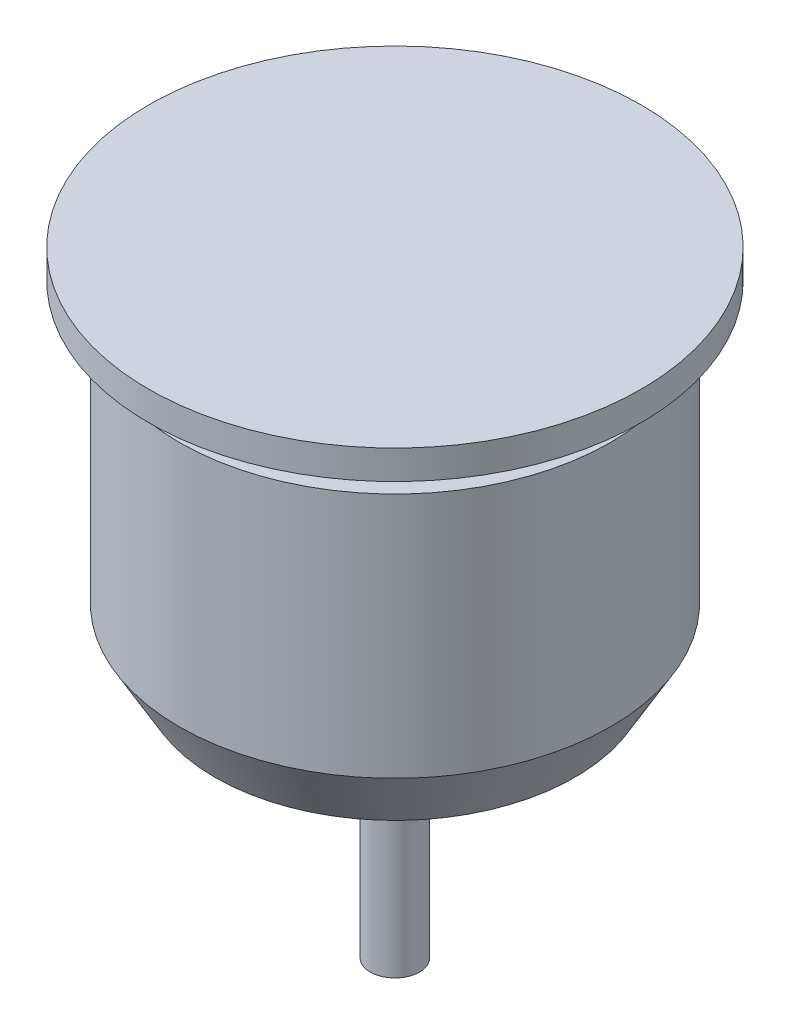
ISO-10303-21;
HEADER;
FILE_DESCRIPTION(('STEP AP214'),'2;1');
FILE_NAME('part.step','',(''),(''),'','','');
FILE_SCHEMA(('AUTOMOTIVE_DESIGN { 1 0 10303 214 1 1 1 1 }'));
ENDSEC;
DATA;
#1=APPLICATION_CONTEXT('core data for automotive mechanical design processes');
#2=APPLICATION_PROTOCOL_DEFINITION('international standard','automotive_design',2000,#1);
#3=PRODUCT_CONTEXT('',#1,'mechanical');
#4=PRODUCT('Part','Part','',(#3));
#5=PRODUCT_RELATED_PRODUCT_CATEGORY('part','',(#4));
#6=PRODUCT_DEFINITION_FORMATION('','',#4);
#7=PRODUCT_DEFINITION_CONTEXT('part definition',#1,'design');
#8=PRODUCT_DEFINITION('design','',#6,#7);
#9=PRODUCT_DEFINITION_SHAPE('','',#8);
#10=(LENGTH_UNIT() NAMED_UNIT(*) SI_UNIT(.MILLI.,.METRE.));
#11=(NAMED_UNIT(*) PLANE_ANGLE_UNIT() SI_UNIT($,.RADIAN.));
#12=(NAMED_UNIT(*) SI_UNIT($,.STERADIAN.) SOLID_ANGLE_UNIT());
#13=UNCERTAINTY_MEASURE_WITH_UNIT(LENGTH_MEASURE(1.E-05),#10,'distance_accuracy_value','');
#14=(GEOMETRIC_REPRESENTATION_CONTEXT(3) GLOBAL_UNCERTAINTY_ASSIGNED_CONTEXT((#13)) GLOBAL_UNIT_ASSIGNED_CONTEXT((#10,
#11,#12)) REPRESENTATION_CONTEXT('',''));
#15=CARTESIAN_POINT('',(0.,0.,0.));
#16=DIRECTION('',(0.,0.,1.));
#17=DIRECTION('',(1.,0.,0.));
#18=AXIS2_PLACEMENT_3D('',#15,#16,#17);
#19=CARTESIAN_POINT('',(0.,30.5766557380375,0.));
#20=DIRECTION('',(0.,-1.,0.));
#21=DIRECTION('',(0.,0.,-1.));
#22=AXIS2_PLACEMENT_3D('',#19,#20,#21);
#23=PLANE('',#22);
#24=CARTESIAN_POINT('',(0.,30.5766557380375,0.));
#25=DIRECTION('',(0.,-1.,0.));
#26=DIRECTION('',(0.,0.,-1.));
#27=AXIS2_PLACEMENT_3D('',#24,#25,#26);
#28=CIRCLE('',#27,1.89972724080792);
#29=CARTESIAN_POINT('',(0.,30.5766557380375,-1.89972724080792));
#30=VERTEX_POINT('',#29);
#31=EDGE_CURVE('E11',#30,#30,#28,.T.);
#32=ORIENTED_EDGE('',*,*,#31,.T.);
#33=EDGE_LOOP('',(#32));
#34=FACE_BOUND('',#33,.T.);
#35=ADVANCED_FACE('F38',(#34),#23,.T.);
#36=CARTESIAN_POINT('',(0.,0.,0.));
#37=DIRECTION('',(0.,-1.,0.));
#38=DIRECTION('',(0.,0.,-1.));
#39=AXIS2_PLACEMENT_3D('',#36,#37,#38);
#40=CYLINDRICAL_SURFACE('',#39,1.89972724080792);
#41=CARTESIAN_POINT('',(0.,32.6480691756281,0.));
#42=DIRECTION('',(0.,-1.,0.));
#43=DIRECTION('',(0.,0.,-1.));
#44=AXIS2_PLACEMENT_3D('',#41,#42,#43);
#45=CIRCLE('',#44,1.89972724080792);
#46=CARTESIAN_POINT('',(0.,32.6480691756281,-1.89972724080792));
#47=VERTEX_POINT('',#46);
#48=EDGE_CURVE('E44',#47,#47,#45,.T.);
#49=ORIENTED_EDGE('',*,*,#48,.T.);
#50=EDGE_LOOP('',(#49));
#51=FACE_BOUND('',#50,.T.);
#52=ORIENTED_EDGE('',*,*,#31,.F.);
#53=EDGE_LOOP('',(#52));
#54=FACE_BOUND('',#53,.T.);
#55=ADVANCED_FACE('F82',(#51,#54),#40,.T.);
#56=CARTESIAN_POINT('',(1.89972724080792,32.6480691756281,0.));
#57=DIRECTION('',(0.,-1.,0.));
#58=DIRECTION('',(0.,0.,-1.));
#59=AXIS2_PLACEMENT_3D('',#56,#57,#58);
#60=PLANE('',#59);
#61=CARTESIAN_POINT('',(0.,32.6480691756281,0.));
#62=DIRECTION('',(0.,-1.,0.));
#63=DIRECTION('',(0.,0.,-1.));
#64=AXIS2_PLACEMENT_3D('',#61,#62,#63);
#65=CIRCLE('',#64,12.5329828871063);
#66=CARTESIAN_POINT('',(0.,32.6480691756281,-12.5329828871063));
#67=VERTEX_POINT('',#66);
#68=EDGE_CURVE('E48',#67,#67,#65,.T.);
#69=ORIENTED_EDGE('',*,*,#68,.T.);
#70=EDGE_LOOP('',(#69));
#71=FACE_BOUND('',#70,.T.);
#72=ORIENTED_EDGE('',*,*,#48,.F.);
#73=EDGE_LOOP('',(#72));
#74=FACE_BOUND('',#73,.T.);
#75=ADVANCED_FACE('F86',(#71,#74),#60,.T.);
#76=CARTESIAN_POINT('',(0.,0.,0.));
#77=DIRECTION('',(0.,-1.,0.));
#78=DIRECTION('',(0.,0.,-1.));
#79=AXIS2_PLACEMENT_3D('',#76,#77,#78);
#80=CYLINDRICAL_SURFACE('',#79,12.5329828871063);
#81=CARTESIAN_POINT('',(0.,45.,0.));
#82=DIRECTION('',(0.,-1.,0.));
#83=DIRECTION('',(0.,0.,-1.));
#84=AXIS2_PLACEMENT_3D('',#81,#82,#83);
#85=CIRCLE('',#84,12.5329828871063);
#86=CARTESIAN_POINT('',(0.,45.,-12.5329828871063));
#87=VERTEX_POINT('',#86);
#88=EDGE_CURVE('E52',#87,#87,#85,.T.);
#89=ORIENTED_EDGE('',*,*,#88,.T.);
#90=EDGE_LOOP('',(#89));
#91=FACE_BOUND('',#90,.T.);
#92=ORIENTED_EDGE('',*,*,#68,.F.);
#93=EDGE_LOOP('',(#92));
#94=FACE_BOUND('',#93,.T.);
#95=ADVANCED_FACE('F90',(#91,#94),#80,.T.);
#96=CARTESIAN_POINT('',(12.5329828871063,45.,0.));
#97=DIRECTION('',(0.,1.,0.));
#98=DIRECTION('',(0.,0.,1.));
#99=AXIS2_PLACEMENT_3D('',#96,#97,#98);
#100=PLANE('',#99);
#101=CARTESIAN_POINT('',(0.,45.,0.));
#102=DIRECTION('',(0.,-1.,0.));
#103=DIRECTION('',(0.,0.,-1.));
#104=AXIS2_PLACEMENT_3D('',#101,#102,#103);
#105=CIRCLE('',#104,1.89972724080791);
#106=CARTESIAN_POINT('',(0.,45.,-1.89972724080791));
#107=VERTEX_POINT('',#106);
#108=EDGE_CURVE('E57',#107,#107,#105,.T.);
#109=ORIENTED_EDGE('',*,*,#108,.T.);
#110=EDGE_LOOP('',(#109));
#111=FACE_BOUND('',#110,.T.);
#112=ORIENTED_EDGE('',*,*,#88,.F.);
#113=EDGE_LOOP('',(#112));
#114=FACE_BOUND('',#113,.T.);
#115=ADVANCED_FACE('F97',(#111,#114),#100,.T.);
#116=CARTESIAN_POINT('',(0.,0.,0.));
#117=DIRECTION('',(0.,-1.,0.));
#118=DIRECTION('',(0.,0.,-1.));
#119=AXIS2_PLACEMENT_3D('',#116,#117,#118);
#120=CYLINDRICAL_SURFACE('',#119,1.89972724080791);
#121=CARTESIAN_POINT('',(0.,47.6432017419177,0.));
#122=DIRECTION('',(0.,-1.,0.));
#123=DIRECTION('',(0.,0.,-1.));
#124=AXIS2_PLACEMENT_3D('',#121,#122,#123);
#125=CIRCLE('',#124,1.89972724080791);
#126=CARTESIAN_POINT('',(0.,47.6432017419177,-1.89972724080791));
#127=VERTEX_POINT('',#126);
#128=EDGE_CURVE('E60',#127,#127,#125,.T.);
#129=ORIENTED_EDGE('',*,*,#128,.T.);
#130=EDGE_LOOP('',(#129));
#131=FACE_BOUND('',#130,.T.);
#132=ORIENTED_EDGE('',*,*,#108,.F.);
#133=EDGE_LOOP('',(#132));
#134=FACE_BOUND('',#133,.T.);
#135=ADVANCED_FACE('F101',(#131,#134),#120,.T.);
#136=CARTESIAN_POINT('',(1.89972724080791,47.6432017419177,0.));
#137=DIRECTION('',(0.,-1.,0.));
#138=DIRECTION('',(0.,0.,-1.));
#139=AXIS2_PLACEMENT_3D('',#136,#137,#138);
#140=PLANE('',#139);
#141=CARTESIAN_POINT('',(0.,47.6432017419177,0.));
#142=DIRECTION('',(0.,-1.,0.));
#143=DIRECTION('',(0.,0.,-1.));
#144=AXIS2_PLACEMENT_3D('',#141,#142,#143);
#145=CIRCLE('',#144,20.);
#146=CARTESIAN_POINT('',(0.,47.6432017419177,-20.));
#147=VERTEX_POINT('',#146);
#148=EDGE_CURVE('E63',#147,#147,#145,.T.);
#149=ORIENTED_EDGE('',*,*,#148,.T.);
#150=EDGE_LOOP('',(#149));
#151=FACE_BOUND('',#150,.T.);
#152=ORIENTED_EDGE('',*,*,#128,.F.);
#153=EDGE_LOOP('',(#152));
#154=FACE_BOUND('',#153,.T.);
#155=ADVANCED_FACE('F79',(#151,#154),#140,.T.);
#156=CARTESIAN_POINT('',(0.,0.,0.));
#157=DIRECTION('',(0.,-1.,0.));
#158=DIRECTION('',(0.,0.,-1.));
#159=AXIS2_PLACEMENT_3D('',#156,#157,#158);
#160=CYLINDRICAL_SURFACE('',#159,20.);
#161=CARTESIAN_POINT('',(0.,50.,0.));
#162=DIRECTION('',(0.,-1.,0.));
#163=DIRECTION('',(0.,0.,-1.));
#164=AXIS2_PLACEMENT_3D('',#161,#162,#163);
#165=CIRCLE('',#164,20.);
#166=CARTESIAN_POINT('',(0.,50.,-20.));
#167=VERTEX_POINT('',#166);
#168=EDGE_CURVE('E66',#167,#167,#165,.T.);
#169=ORIENTED_EDGE('',*,*,#168,.T.);
#170=EDGE_LOOP('',(#169));
#171=FACE_BOUND('',#170,.T.);
#172=ORIENTED_EDGE('',*,*,#148,.F.);
#173=EDGE_LOOP('',(#172));
#174=FACE_BOUND('',#173,.T.);
#175=ADVANCED_FACE('F70',(#171,#174),#160,.T.);
#176=CARTESIAN_POINT('',(20.,50.,0.));
#177=DIRECTION('',(0.,1.,0.));
#178=DIRECTION('',(0.,0.,1.));
#179=AXIS2_PLACEMENT_3D('',#176,#177,#178);
#180=PLANE('',#179);
#181=ORIENTED_EDGE('',*,*,#168,.F.);
#182=EDGE_LOOP('',(#181));
#183=FACE_BOUND('',#182,.T.);
#184=ADVANCED_FACE('F73',(#183),#180,.T.);
#185=CLOSED_SHELL('',(#35,#55,#75,#95,#115,#135,#155,#175,#184));
#186=MANIFOLD_SOLID_BREP('B2',#185);
#187=CARTESIAN_POINT('',(0.,0.,0.));
#188=DIRECTION('',(0.,-1.,0.));
#189=DIRECTION('',(0.,0.,-1.));
#190=AXIS2_PLACEMENT_3D('',#187,#188,#189);
#191=PLANE('',#190);
#192=CARTESIAN_POINT('',(0.,0.,0.));
#193=DIRECTION('',(0.,-1.,0.));
#194=DIRECTION('',(0.,0.,-1.));
#195=AXIS2_PLACEMENT_3D('',#192,#193,#194);
#196=CIRCLE('',#195,2.);
#197=CARTESIAN_POINT('',(0.,0.,-2.));
#198=VERTEX_POINT('',#197);
#199=EDGE_CURVE('E37',#198,#198,#196,.T.);
#200=ORIENTED_EDGE('',*,*,#199,.T.);
#201=EDGE_LOOP('',(#200));
#202=FACE_BOUND('',#201,.T.);
#203=ADVANCED_FACE('F168',(#202),#191,.T.);
#204=CARTESIAN_POINT('',(0.,0.,0.));
#205=DIRECTION('',(0.,-1.,0.));
#206=DIRECTION('',(0.,0.,-1.));
#207=AXIS2_PLACEMENT_3D('',#204,#205,#206);
#208=CYLINDRICAL_SURFACE('',#207,2.);
#209=CARTESIAN_POINT('',(0.,20.,0.));
#210=DIRECTION('',(0.,-1.,0.));
#211=DIRECTION('',(0.,0.,-1.));
#212=AXIS2_PLACEMENT_3D('',#209,#210,#211);
#213=CIRCLE('',#212,2.);
#214=CARTESIAN_POINT('',(0.,20.,-2.));
#215=VERTEX_POINT('',#214);
#216=EDGE_CURVE('E174',#215,#215,#213,.T.);
#217=ORIENTED_EDGE('',*,*,#216,.T.);
#218=EDGE_LOOP('',(#217));
#219=FACE_BOUND('',#218,.T.);
#220=ORIENTED_EDGE('',*,*,#199,.F.);
#221=EDGE_LOOP('',(#220));
#222=FACE_BOUND('',#221,.T.);
#223=ADVANCED_FACE('F209',(#219,#222),#208,.T.);
#224=CARTESIAN_POINT('',(2.,20.,0.));
#225=DIRECTION('',(0.,-1.,0.));
#226=DIRECTION('',(0.,0.,-1.));
#227=AXIS2_PLACEMENT_3D('',#224,#225,#226);
#228=PLANE('',#227);
#229=CARTESIAN_POINT('',(0.,20.,0.));
#230=DIRECTION('',(0.,-1.,0.));
#231=DIRECTION('',(0.,0.,-1.));
#232=AXIS2_PLACEMENT_3D('',#229,#230,#231);
#233=CIRCLE('',#232,14.6132486540519);
#234=CARTESIAN_POINT('',(0.,20.,-14.6132486540519));
#235=VERTEX_POINT('',#234);
#236=EDGE_CURVE('E178',#235,#235,#233,.T.);
#237=ORIENTED_EDGE('',*,*,#236,.T.);
#238=EDGE_LOOP('',(#237));
#239=FACE_BOUND('',#238,.T.);
#240=ORIENTED_EDGE('',*,*,#216,.F.);
#241=EDGE_LOOP('',(#240));
#242=FACE_BOUND('',#241,.T.);
#243=ADVANCED_FACE('F213',(#239,#242),#228,.T.);
#244=CARTESIAN_POINT('',(0.,20.,0.));
#245=DIRECTION('',(0.,1.,0.));
#246=DIRECTION('',(0.,0.,1.));
#247=AXIS2_PLACEMENT_3D('',#244,#245,#246);
#248=CONICAL_SURFACE('',#247,14.6132486540519,0.523598775598296);
#249=CARTESIAN_POINT('',(0.,25.,0.));
#250=DIRECTION('',(0.,-1.,0.));
#251=DIRECTION('',(0.,0.,-1.));
#252=AXIS2_PLACEMENT_3D('',#249,#250,#251);
#253=CIRCLE('',#252,17.5);
#254=CARTESIAN_POINT('',(0.,25.,-17.5));
#255=VERTEX_POINT('',#254);
#256=EDGE_CURVE('E182',#255,#255,#253,.T.);
#257=ORIENTED_EDGE('',*,*,#256,.T.);
#258=EDGE_LOOP('',(#257));
#259=FACE_BOUND('',#258,.T.);
#260=ORIENTED_EDGE('',*,*,#236,.F.);
#261=EDGE_LOOP('',(#260));
#262=FACE_BOUND('',#261,.T.);
#263=ADVANCED_FACE('F217',(#259,#262),#248,.T.);
#264=CARTESIAN_POINT('',(0.,0.,0.));
#265=DIRECTION('',(0.,-1.,0.));
#266=DIRECTION('',(0.,0.,-1.));
#267=AXIS2_PLACEMENT_3D('',#264,#265,#266);
#268=CYLINDRICAL_SURFACE('',#267,17.5);
#269=CARTESIAN_POINT('',(0.,45.,0.));
#270=DIRECTION('',(0.,-1.,0.));
#271=DIRECTION('',(0.,0.,-1.));
#272=AXIS2_PLACEMENT_3D('',#269,#270,#271);
#273=CIRCLE('',#272,17.5);
#274=CARTESIAN_POINT('',(0.,45.,-17.5));
#275=VERTEX_POINT('',#274);
#276=EDGE_CURVE('E187',#275,#275,#273,.T.);
#277=ORIENTED_EDGE('',*,*,#276,.T.);
#278=EDGE_LOOP('',(#277));
#279=FACE_BOUND('',#278,.T.);
#280=ORIENTED_EDGE('',*,*,#256,.F.);
#281=EDGE_LOOP('',(#280));
#282=FACE_BOUND('',#281,.T.);
#283=ADVANCED_FACE('F224',(#279,#282),#268,.T.);
#284=CARTESIAN_POINT('',(17.5,45.,0.));
#285=DIRECTION('',(0.,1.,0.));
#286=DIRECTION('',(0.,0.,1.));
#287=AXIS2_PLACEMENT_3D('',#284,#285,#286);
#288=PLANE('',#287);
#289=CARTESIAN_POINT('',(0.,45.,0.));
#290=DIRECTION('',(0.,-1.,0.));
#291=DIRECTION('',(0.,0.,-1.));
#292=AXIS2_PLACEMENT_3D('',#289,#290,#291);
#293=CIRCLE('',#292,14.5);
#294=CARTESIAN_POINT('',(0.,45.,-14.5));
#295=VERTEX_POINT('',#294);
#296=EDGE_CURVE('E190',#295,#295,#293,.T.);
#297=ORIENTED_EDGE('',*,*,#296,.T.);
#298=EDGE_LOOP('',(#297));
#299=FACE_BOUND('',#298,.T.);
#300=ORIENTED_EDGE('',*,*,#276,.F.);
#301=EDGE_LOOP('',(#300));
#302=FACE_BOUND('',#301,.T.);
#303=ADVANCED_FACE('F206',(#299,#302),#288,.T.);
#304=CARTESIAN_POINT('',(0.,0.,0.));
#305=DIRECTION('',(0.,-1.,0.));
#306=DIRECTION('',(0.,0.,-1.));
#307=AXIS2_PLACEMENT_3D('',#304,#305,#306);
#308=CYLINDRICAL_SURFACE('',#307,14.5);
#309=CARTESIAN_POINT('',(0.,29.,0.));
#310=DIRECTION('',(0.,-1.,0.));
#311=DIRECTION('',(0.,0.,-1.));
#312=AXIS2_PLACEMENT_3D('',#309,#310,#311);
#313=CIRCLE('',#312,14.5);
#314=CARTESIAN_POINT('',(0.,29.,-14.5));
#315=VERTEX_POINT('',#314);
#316=EDGE_CURVE('E193',#315,#315,#313,.T.);
#317=ORIENTED_EDGE('',*,*,#316,.T.);
#318=EDGE_LOOP('',(#317));
#319=FACE_BOUND('',#318,.T.);
#320=ORIENTED_EDGE('',*,*,#296,.F.);
#321=EDGE_LOOP('',(#320));
#322=FACE_BOUND('',#321,.T.);
#323=ADVANCED_FACE('F197',(#319,#322),#308,.F.);
#324=CARTESIAN_POINT('',(14.5,29.,0.));
#325=DIRECTION('',(0.,1.,0.));
#326=DIRECTION('',(0.,0.,1.));
#327=AXIS2_PLACEMENT_3D('',#324,#325,#326);
#328=PLANE('',#327);
#329=ORIENTED_EDGE('',*,*,#316,.F.);
#330=EDGE_LOOP('',(#329));
#331=FACE_BOUND('',#330,.T.);
#332=ADVANCED_FACE('F200',(#331),#328,.T.);
#333=CLOSED_SHELL('',(#203,#223,#243,#263,#283,#303,#323,#332));
#334=MANIFOLD_SOLID_BREP('B6',#333);
#335=ADVANCED_BREP_SHAPE_REPRESENTATION('',(#18,#186,#334),#14);
#336=SHAPE_DEFINITION_REPRESENTATION(#9,#335);
ENDSEC;
END-ISO-10303-21;
